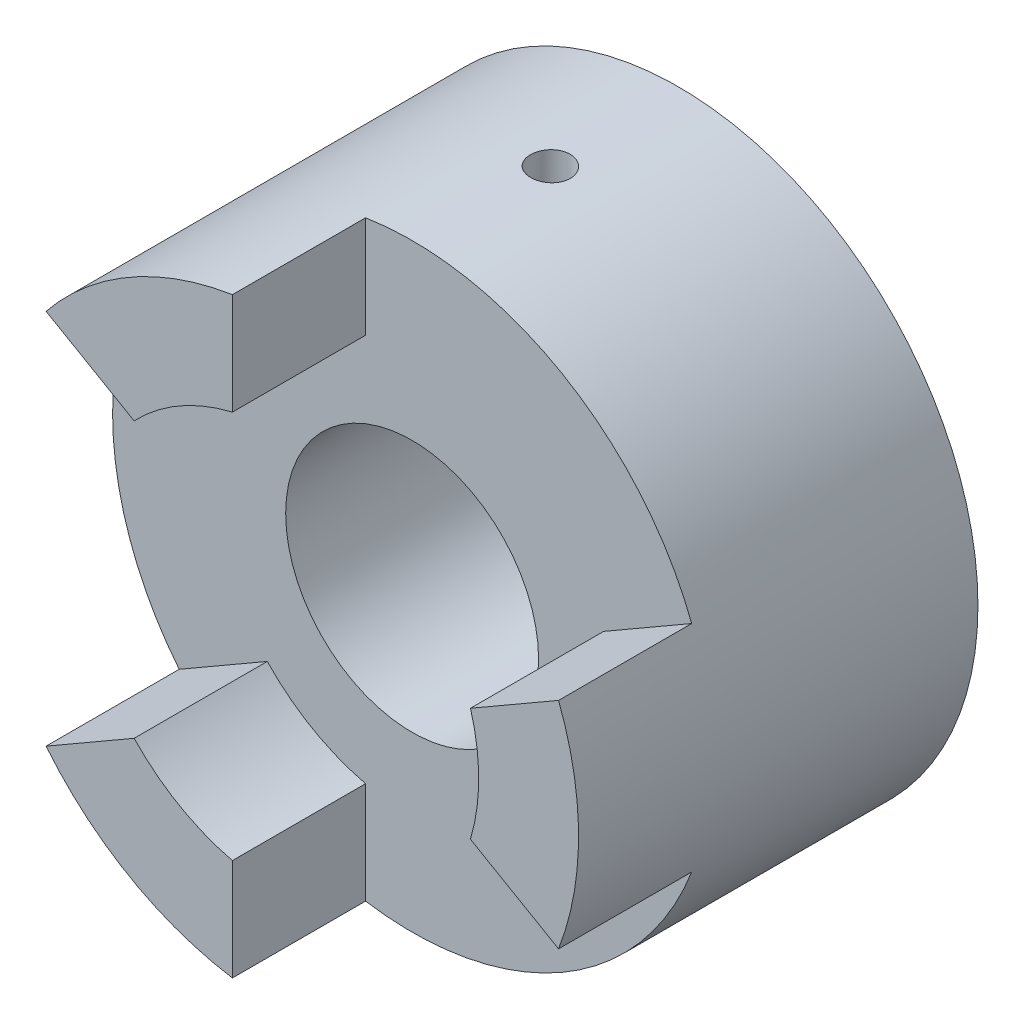
ISO-10303-21;
HEADER;
FILE_DESCRIPTION(('STEP AP214'),'2;1');
FILE_NAME('part.step','',(''),(''),'','','');
FILE_SCHEMA(('AUTOMOTIVE_DESIGN { 1 0 10303 214 1 1 1 1 }'));
ENDSEC;
DATA;
#1=APPLICATION_CONTEXT('core data for automotive mechanical design processes');
#2=APPLICATION_PROTOCOL_DEFINITION('international standard','automotive_design',2000,#1);
#3=PRODUCT_CONTEXT('',#1,'mechanical');
#4=PRODUCT('Part','Part','',(#3));
#5=PRODUCT_RELATED_PRODUCT_CATEGORY('part','',(#4));
#6=PRODUCT_DEFINITION_FORMATION('','',#4);
#7=PRODUCT_DEFINITION_CONTEXT('part definition',#1,'design');
#8=PRODUCT_DEFINITION('design','',#6,#7);
#9=PRODUCT_DEFINITION_SHAPE('','',#8);
#10=(LENGTH_UNIT() NAMED_UNIT(*) SI_UNIT(.MILLI.,.METRE.));
#11=(NAMED_UNIT(*) PLANE_ANGLE_UNIT() SI_UNIT($,.RADIAN.));
#12=(NAMED_UNIT(*) SI_UNIT($,.STERADIAN.) SOLID_ANGLE_UNIT());
#13=UNCERTAINTY_MEASURE_WITH_UNIT(LENGTH_MEASURE(1.E-05),#10,'distance_accuracy_value','');
#14=(GEOMETRIC_REPRESENTATION_CONTEXT(3) GLOBAL_UNCERTAINTY_ASSIGNED_CONTEXT((#13)) GLOBAL_UNIT_ASSIGNED_CONTEXT((#10,
#11,#12)) REPRESENTATION_CONTEXT('',''));
#15=CARTESIAN_POINT('',(0.,0.,0.));
#16=DIRECTION('',(0.,0.,1.));
#17=DIRECTION('',(1.,0.,0.));
#18=AXIS2_PLACEMENT_3D('',#15,#16,#17);
#19=CARTESIAN_POINT('',(0.,0.,20.));
#20=DIRECTION('',(0.,0.,1.));
#21=DIRECTION('',(1.,0.,0.));
#22=AXIS2_PLACEMENT_3D('',#19,#20,#21);
#23=PLANE('',#22);
#24=CARTESIAN_POINT('',(0.,0.,20.));
#25=DIRECTION('',(0.,0.,1.));
#26=DIRECTION('',(1.,0.,0.));
#27=AXIS2_PLACEMENT_3D('',#24,#25,#26);
#28=CIRCLE('',#27,9.5);
#29=CARTESIAN_POINT('',(9.5,0.,20.));
#30=VERTEX_POINT('',#29);
#31=EDGE_CURVE('E244',#30,#30,#28,.T.);
#32=ORIENTED_EDGE('',*,*,#31,.F.);
#33=EDGE_LOOP('',(#32));
#34=FACE_BOUND('',#33,.T.);
#35=CARTESIAN_POINT('',(0.,0.,20.));
#36=DIRECTION('',(0.,0.,-1.));
#37=DIRECTION('',(1.,0.,0.));
#38=AXIS2_PLACEMENT_3D('',#35,#36,#37);
#39=CIRCLE('',#38,15.);
#40=CARTESIAN_POINT('',(-3.5,-14.5859521458148,20.));
#41=VERTEX_POINT('',#40);
#42=CARTESIAN_POINT('',(-10.8818050966599,-10.3240649861528,20.));
#43=VERTEX_POINT('',#42);
#44=EDGE_CURVE('E53',#41,#43,#39,.T.);
#45=ORIENTED_EDGE('',*,*,#44,.F.);
#46=DIRECTION('',(0.,1.,0.));
#47=VECTOR('',#46,1.);
#48=CARTESIAN_POINT('',(-3.5,-14.5859521458148,20.));
#49=LINE('',#48,#47);
#50=CARTESIAN_POINT('',(-3.5,-22.2261107708929,20.));
#51=VERTEX_POINT('',#50);
#52=EDGE_CURVE('E402',#51,#41,#49,.T.);
#53=ORIENTED_EDGE('',*,*,#52,.F.);
#54=CARTESIAN_POINT('',(0.,0.,20.));
#55=DIRECTION('',(0.,0.,1.));
#56=DIRECTION('',(1.,0.,0.));
#57=AXIS2_PLACEMENT_3D('',#54,#55,#56);
#58=CIRCLE('',#57,22.5);
#59=CARTESIAN_POINT('',(20.9983765549201,-8.081966472201,20.));
#60=VERTEX_POINT('',#59);
#61=EDGE_CURVE('E39',#51,#60,#58,.T.);
#62=ORIENTED_EDGE('',*,*,#61,.T.);
#63=DIRECTION('',(0.866025403784436,-0.500000000000004,0.));
#64=VECTOR('',#63,1.);
#65=CARTESIAN_POINT('',(20.9983765549201,-8.081966472201,20.));
#66=LINE('',#65,#64);
#67=CARTESIAN_POINT('',(14.3818050966598,-4.26188715966194,20.));
#68=VERTEX_POINT('',#67);
#69=EDGE_CURVE('E161',#68,#60,#66,.T.);
#70=ORIENTED_EDGE('',*,*,#69,.F.);
#71=CARTESIAN_POINT('',(0.,0.,20.));
#72=DIRECTION('',(0.,0.,-1.));
#73=DIRECTION('',(1.,0.,0.));
#74=AXIS2_PLACEMENT_3D('',#71,#72,#73);
#75=CIRCLE('',#74,15.);
#76=CARTESIAN_POINT('',(14.3818050966598,4.26188715966176,20.));
#77=VERTEX_POINT('',#76);
#78=EDGE_CURVE('E151',#77,#68,#75,.T.);
#79=ORIENTED_EDGE('',*,*,#78,.F.);
#80=DIRECTION('',(-0.866025403784443,-0.499999999999992,0.));
#81=VECTOR('',#80,1.);
#82=CARTESIAN_POINT('',(14.3818050966598,4.26188715966176,20.));
#83=LINE('',#82,#81);
#84=CARTESIAN_POINT('',(20.9983765549202,8.08196647220072,20.));
#85=VERTEX_POINT('',#84);
#86=EDGE_CURVE('E149',#85,#77,#83,.T.);
#87=ORIENTED_EDGE('',*,*,#86,.F.);
#88=CARTESIAN_POINT('',(-3.50000000000001,22.2261107708929,20.));
#89=VERTEX_POINT('',#88);
#90=EDGE_CURVE('E216',#85,#89,#58,.T.);
#91=ORIENTED_EDGE('',*,*,#90,.T.);
#92=DIRECTION('',(0.,1.,0.));
#93=VECTOR('',#92,1.);
#94=CARTESIAN_POINT('',(-3.5,22.2261107708929,20.));
#95=LINE('',#94,#93);
#96=CARTESIAN_POINT('',(-3.5,14.5859521458148,20.));
#97=VERTEX_POINT('',#96);
#98=EDGE_CURVE('E194',#97,#89,#95,.T.);
#99=ORIENTED_EDGE('',*,*,#98,.F.);
#100=CARTESIAN_POINT('',(0.,0.,20.));
#101=DIRECTION('',(0.,0.,-1.));
#102=DIRECTION('',(1.,0.,0.));
#103=AXIS2_PLACEMENT_3D('',#100,#101,#102);
#104=CIRCLE('',#103,15.);
#105=CARTESIAN_POINT('',(-10.8818050966597,10.324064986153,20.));
#106=VERTEX_POINT('',#105);
#107=EDGE_CURVE('E180',#106,#97,#104,.T.);
#108=ORIENTED_EDGE('',*,*,#107,.F.);
#109=DIRECTION('',(0.866025403784436,-0.500000000000004,0.));
#110=VECTOR('',#109,1.);
#111=CARTESIAN_POINT('',(-17.4983765549201,14.1441442986921,20.));
#112=LINE('',#111,#110);
#113=CARTESIAN_POINT('',(-17.4983765549201,14.144144298692,20.));
#114=VERTEX_POINT('',#113);
#115=EDGE_CURVE('E185',#114,#106,#112,.T.);
#116=ORIENTED_EDGE('',*,*,#115,.F.);
#117=CARTESIAN_POINT('',(-17.4983765549203,-14.1441442986918,20.));
#118=VERTEX_POINT('',#117);
#119=EDGE_CURVE('E45',#114,#118,#58,.T.);
#120=ORIENTED_EDGE('',*,*,#119,.T.);
#121=DIRECTION('',(-0.866025403784443,-0.499999999999992,0.));
#122=VECTOR('',#121,1.);
#123=CARTESIAN_POINT('',(-17.4983765549203,-14.1441442986918,20.));
#124=LINE('',#123,#122);
#125=EDGE_CURVE('E58',#43,#118,#124,.T.);
#126=ORIENTED_EDGE('',*,*,#125,.F.);
#127=EDGE_LOOP('',(#45,#53,#62,#70,#79,#87,#91,#99,#108,#116,#120,#126));
#128=FACE_BOUND('',#127,.T.);
#129=ADVANCED_FACE('F34',(#34,#128),#23,.T.);
#130=CARTESIAN_POINT('',(0.,0.,20.));
#131=DIRECTION('',(0.,0.,-1.));
#132=DIRECTION('',(-1.,0.,0.));
#133=AXIS2_PLACEMENT_3D('',#130,#131,#132);
#134=CYLINDRICAL_SURFACE('',#133,22.5);
#135=CARTESIAN_POINT('',(-1.16795072214175,22.4696660213419,9.9509839765561));
#136=CARTESIAN_POINT('',(-1.16794701412822,22.4696666351266,9.86682882468708));
#137=CARTESIAN_POINT('',(-1.16083853462614,22.4700392018296,9.78261503637612));
#138=CARTESIAN_POINT('',(-1.13258449434566,22.471480697484,9.61651364954389));
#139=CARTESIAN_POINT('',(-1.11142267175415,22.4725504331371,9.5346288606282));
#140=CARTESIAN_POINT('',(-1.05567496758904,22.4752380311045,9.37561546316127));
#141=CARTESIAN_POINT('',(-1.02109626483874,22.4768556002368,9.29848433665232));
#142=CARTESIAN_POINT('',(-0.939510841472762,22.4804132200468,9.15113626091315));
#143=CARTESIAN_POINT('',(-0.892506933100566,22.4823531977157,9.08091775205354));
#144=CARTESIAN_POINT('',(-0.787321799091392,22.4862822653723,8.9492495333017));
#145=CARTESIAN_POINT('',(-0.729123980123893,22.488271424401,8.88781308018272));
#146=CARTESIAN_POINT('',(-0.603241089186681,22.4919998434333,8.77556647860183));
#147=CARTESIAN_POINT('',(-0.535555618423458,22.4937390929262,8.72475677703693));
#148=CARTESIAN_POINT('',(-0.392546510837813,22.4966890716028,8.63516458913433));
#149=CARTESIAN_POINT('',(-0.317215933429358,22.4978993151447,8.59639316367709));
#150=CARTESIAN_POINT('',(-0.161106583630494,22.4995584749486,8.53204891038463));
#151=CARTESIAN_POINT('',(-0.0803278761180135,22.500007400275,8.50647592540988));
#152=CARTESIAN_POINT('',(0.0842541461032171,22.4999924287302,8.46929151286395));
#153=CARTESIAN_POINT('',(0.168052740501643,22.499529900542,8.4576591934942));
#154=CARTESIAN_POINT('',(0.336402293717323,22.4976425119387,8.44862178180597));
#155=CARTESIAN_POINT('',(0.420953243062837,22.4962176636219,8.45121651062898));
#156=CARTESIAN_POINT('',(0.588266129708601,22.4924639826339,8.47054233443924));
#157=CARTESIAN_POINT('',(0.67103069653389,22.4901365901524,8.48725095768299));
#158=CARTESIAN_POINT('',(0.832565993292586,22.4847363612551,8.53429538928928));
#159=CARTESIAN_POINT('',(0.911336697020258,22.4816635199487,8.56463128705432));
#160=CARTESIAN_POINT('',(1.06272261164742,22.4750166272793,8.63809451797387));
#161=CARTESIAN_POINT('',(1.13533287297505,22.4714421789089,8.6812320136648));
#162=CARTESIAN_POINT('',(1.2722859030292,22.4641046836031,8.77906653524814));
#163=CARTESIAN_POINT('',(1.33662856545644,22.4603416342438,8.83376370974329));
#164=CARTESIAN_POINT('',(1.45535453244866,22.4529618562286,8.95329180612418));
#165=CARTESIAN_POINT('',(1.50971821721403,22.449345426488,9.01814223651269));
#166=CARTESIAN_POINT('',(1.60679530484671,22.4426064521477,9.15606769541081));
#167=CARTESIAN_POINT('',(1.64950870236193,22.439483907775,9.22914272769877));
#168=CARTESIAN_POINT('',(1.7220745704774,22.4340319588832,9.38145576222379));
#169=CARTESIAN_POINT('',(1.75192618133141,22.4317026073872,9.46069417603434));
#170=CARTESIAN_POINT('',(1.79790975507206,22.4280640531212,9.62307881670943));
#171=CARTESIAN_POINT('',(1.81404190173043,22.4267548366865,9.7062249912139));
#172=CARTESIAN_POINT('',(1.83210546711131,22.4252864697945,9.87389368251136));
#173=CARTESIAN_POINT('',(1.83406414738777,22.4251251115319,9.95841324354472));
#174=CARTESIAN_POINT('',(1.82379660597111,22.4259624418472,10.1265800340995));
#175=CARTESIAN_POINT('',(1.81157046841159,22.4269611235448,10.2102272687919));
#176=CARTESIAN_POINT('',(1.77330198524295,22.430019264112,10.3741975858724));
#177=CARTESIAN_POINT('',(1.74727222536644,22.432077756628,10.4545236246261));
#178=CARTESIAN_POINT('',(1.68214605935868,22.4370551772429,10.60966269689));
#179=CARTESIAN_POINT('',(1.64304951843054,22.4399741142182,10.6844756735177));
#180=CARTESIAN_POINT('',(1.5528271333128,22.4463976750895,10.8265902326363));
#181=CARTESIAN_POINT('',(1.50168303140065,22.4499031855614,10.8938801836915));
#182=CARTESIAN_POINT('',(1.38884040962061,22.4571661269891,11.0189213375547));
#183=CARTESIAN_POINT('',(1.3271417726129,22.4609235607405,11.0766724344814));
#184=CARTESIAN_POINT('',(1.19482048170147,22.4683509312009,11.1810888947149));
#185=CARTESIAN_POINT('',(1.1241838714648,22.4720207201659,11.2277365849532));
#186=CARTESIAN_POINT('',(0.976058442943612,22.4789412520019,11.3085010832813));
#187=CARTESIAN_POINT('',(0.89856967163721,22.4821919977453,11.3426179772733));
#188=CARTESIAN_POINT('',(0.739001568444851,22.4880021362221,11.3973217571046));
#189=CARTESIAN_POINT('',(0.656926076696509,22.4905620971359,11.4179197825061));
#190=CARTESIAN_POINT('',(0.49045958171309,22.4948078152173,11.445037570028));
#191=CARTESIAN_POINT('',(0.40606860499338,22.4964935823911,11.4515574932931));
#192=CARTESIAN_POINT('',(0.237540917170963,22.4989035911875,11.4503323899263));
#193=CARTESIAN_POINT('',(0.153404030342545,22.4996296909851,11.4426150002337));
#194=CARTESIAN_POINT('',(-0.0123898446146695,22.5001493640251,11.4131917004924));
#195=CARTESIAN_POINT('',(-0.094046828527573,22.4999429356823,11.3914857666642));
#196=CARTESIAN_POINT('',(-0.252564896325961,22.4987221590962,11.3347079254833));
#197=CARTESIAN_POINT('',(-0.329426048193699,22.4977078223081,11.2996362076445));
#198=CARTESIAN_POINT('',(-0.476181328642586,22.4950804526772,11.2171260186757));
#199=CARTESIAN_POINT('',(-0.546075625279928,22.4934674342804,11.1696878459523));
#200=CARTESIAN_POINT('',(-0.677050473510534,22.4899068565662,11.0636887007921));
#201=CARTESIAN_POINT('',(-0.738114734161111,22.4879586930601,11.0051076197651));
#202=CARTESIAN_POINT('',(-0.849564286877072,22.4840245335145,10.8785150339242));
#203=CARTESIAN_POINT('',(-0.899946966889859,22.4820385283505,10.8105012291612));
#204=CARTESIAN_POINT('',(-0.9886424430826,22.47831322808,10.666886676364));
#205=CARTESIAN_POINT('',(-1.02693884290122,22.4765742698621,10.5912758037275));
#206=CARTESIAN_POINT('',(-1.09023738754139,22.47359330319,10.4347413302532));
#207=CARTESIAN_POINT('',(-1.11525505244659,22.4723507150045,10.3538240563899));
#208=CARTESIAN_POINT('',(-1.14480459317688,22.4708599339827,10.2188429666264));
#209=CARTESIAN_POINT('',(-1.15347308513632,22.4704146367155,10.165650945378));
#210=CARTESIAN_POINT('',(-1.16504733114898,22.4698174842866,10.0586419413207));
#211=CARTESIAN_POINT('',(-1.16795309446345,22.4696656286533,10.0048249595162));
#212=CARTESIAN_POINT('',(-1.16795072214175,22.4696660213419,9.9509839765561));
#213=B_SPLINE_CURVE_WITH_KNOTS('',3,(#135,#136,#137,#138,#139,#140,#141,#142,#143,#144,#145,
#146,#147,#148,#149,#150,#151,#152,#153,#154,#155,#156,#157,#158,#159,#160,#161,#162,#163,#164,
#165,#166,#167,#168,#169,#170,#171,#172,#173,#174,#175,#176,#177,#178,#179,#180,#181,#182,#183,
#184,#185,#186,#187,#188,#189,#190,#191,#192,#193,#194,#195,#196,#197,#198,#199,#200,#201,#202,
#203,#204,#205,#206,#207,#208,#209,#210,#211,#212),.UNSPECIFIED.,.T.,.F.,(4,2,2,2,2,2,2,2,2,2,2,
2,2,2,2,2,2,2,2,2,2,2,2,2,2,2,2,2,2,2,2,2,2,2,2,2,2,2,4),(0.,0.252268897261408,
0.504830217080159,0.757256587612157,1.0096258743797,1.26237218560875,1.51512912368541,
1.76811761462682,2.02110309343897,2.27370896646024,2.52631166379775,2.7785129306925,
3.03071585219184,3.28311952276676,3.53552643825509,3.78842441965064,4.04132251722657,
4.2942375171565,4.54714912924566,4.7995741560111,5.05199768558994,5.30419145760964,
5.55638783133998,5.80896888837173,6.06155274886383,6.31453599310349,6.567517503036,
6.82029029333925,7.07306019026671,7.32533993592649,7.57762011044376,7.82989670800653,
8.0821672186178,8.33489737367269,8.58768925975639,8.84082262604519,9.09365947683888,
9.25505693053532,9.41645412485044),.UNSPECIFIED.);
#214=CARTESIAN_POINT('',(-1.16795072214175,22.4696660213419,9.9509839765561));
#215=VERTEX_POINT('',#214);
#216=EDGE_CURVE('E11',#215,#215,#213,.T.);
#217=ORIENTED_EDGE('',*,*,#216,.T.);
#218=EDGE_LOOP('',(#217));
#219=FACE_BOUND('',#218,.T.);
#220=ORIENTED_EDGE('',*,*,#119,.F.);
#221=DIRECTION('',(0.,0.,-1.));
#222=VECTOR('',#221,1.);
#223=CARTESIAN_POINT('',(-17.4983765549201,14.1441442986921,30.));
#224=LINE('',#223,#222);
#225=CARTESIAN_POINT('',(-17.4983765549201,14.1441442986921,30.));
#226=VERTEX_POINT('',#225);
#227=EDGE_CURVE('E206',#226,#114,#224,.T.);
#228=ORIENTED_EDGE('',*,*,#227,.F.);
#229=CARTESIAN_POINT('',(0.,0.,30.));
#230=DIRECTION('',(0.,0.,1.));
#231=DIRECTION('',(1.,0.,0.));
#232=AXIS2_PLACEMENT_3D('',#229,#230,#231);
#233=CIRCLE('',#232,22.5);
#234=CARTESIAN_POINT('',(-3.50000000000001,22.2261107708929,30.));
#235=VERTEX_POINT('',#234);
#236=EDGE_CURVE('E187',#235,#226,#233,.T.);
#237=ORIENTED_EDGE('',*,*,#236,.F.);
#238=DIRECTION('',(0.,0.,-1.));
#239=VECTOR('',#238,1.);
#240=CARTESIAN_POINT('',(-3.50000000000001,22.2261107708929,30.));
#241=LINE('',#240,#239);
#242=EDGE_CURVE('E202',#235,#89,#241,.T.);
#243=ORIENTED_EDGE('',*,*,#242,.T.);
#244=ORIENTED_EDGE('',*,*,#90,.F.);
#245=DIRECTION('',(0.,0.,-1.));
#246=VECTOR('',#245,1.);
#247=CARTESIAN_POINT('',(20.9983765549202,8.08196647220072,30.));
#248=LINE('',#247,#246);
#249=CARTESIAN_POINT('',(20.9983765549202,8.08196647220072,30.));
#250=VERTEX_POINT('',#249);
#251=EDGE_CURVE('E178',#250,#85,#248,.T.);
#252=ORIENTED_EDGE('',*,*,#251,.F.);
#253=CARTESIAN_POINT('',(0.,0.,30.));
#254=DIRECTION('',(0.,0.,1.));
#255=DIRECTION('',(1.,0.,0.));
#256=AXIS2_PLACEMENT_3D('',#253,#254,#255);
#257=CIRCLE('',#256,22.5);
#258=CARTESIAN_POINT('',(20.9983765549201,-8.081966472201,30.));
#259=VERTEX_POINT('',#258);
#260=EDGE_CURVE('E157',#259,#250,#257,.T.);
#261=ORIENTED_EDGE('',*,*,#260,.F.);
#262=DIRECTION('',(0.,0.,-1.));
#263=VECTOR('',#262,1.);
#264=CARTESIAN_POINT('',(20.9983765549201,-8.081966472201,30.));
#265=LINE('',#264,#263);
#266=EDGE_CURVE('E166',#259,#60,#265,.T.);
#267=ORIENTED_EDGE('',*,*,#266,.T.);
#268=ORIENTED_EDGE('',*,*,#61,.F.);
#269=DIRECTION('',(0.,0.,-1.));
#270=VECTOR('',#269,1.);
#271=CARTESIAN_POINT('',(-3.5,-22.2261107708929,30.));
#272=LINE('',#271,#270);
#273=CARTESIAN_POINT('',(-3.5,-22.2261107708929,30.));
#274=VERTEX_POINT('',#273);
#275=EDGE_CURVE('E130',#274,#51,#272,.T.);
#276=ORIENTED_EDGE('',*,*,#275,.F.);
#277=CARTESIAN_POINT('',(0.,0.,30.));
#278=DIRECTION('',(0.,0.,1.));
#279=DIRECTION('',(1.,0.,0.));
#280=AXIS2_PLACEMENT_3D('',#277,#278,#279);
#281=CIRCLE('',#280,22.5);
#282=CARTESIAN_POINT('',(-17.4983765549203,-14.1441442986918,30.));
#283=VERTEX_POINT('',#282);
#284=EDGE_CURVE('E136',#283,#274,#281,.T.);
#285=ORIENTED_EDGE('',*,*,#284,.F.);
#286=DIRECTION('',(0.,0.,-1.));
#287=VECTOR('',#286,1.);
#288=CARTESIAN_POINT('',(-17.4983765549203,-14.1441442986918,30.));
#289=LINE('',#288,#287);
#290=EDGE_CURVE('E394',#283,#118,#289,.T.);
#291=ORIENTED_EDGE('',*,*,#290,.T.);
#292=EDGE_LOOP('',(#220,#228,#237,#243,#244,#252,#261,#267,#268,#276,#285,#291));
#293=FACE_BOUND('',#292,.T.);
#294=CARTESIAN_POINT('',(0.,0.,0.));
#295=DIRECTION('',(0.,0.,1.));
#296=DIRECTION('',(1.,0.,0.));
#297=AXIS2_PLACEMENT_3D('',#294,#295,#296);
#298=CIRCLE('',#297,22.5);
#299=CARTESIAN_POINT('',(22.5,0.,0.));
#300=VERTEX_POINT('',#299);
#301=EDGE_CURVE('E217',#300,#300,#298,.T.);
#302=ORIENTED_EDGE('',*,*,#301,.T.);
#303=EDGE_LOOP('',(#302));
#304=FACE_BOUND('',#303,.T.);
#305=ADVANCED_FACE('F36',(#219,#293,#304),#134,.T.);
#306=CARTESIAN_POINT('',(0.,0.,0.));
#307=DIRECTION('',(0.,0.,1.));
#308=DIRECTION('',(1.,0.,0.));
#309=AXIS2_PLACEMENT_3D('',#306,#307,#308);
#310=PLANE('',#309);
#311=CARTESIAN_POINT('',(0.,0.,0.));
#312=DIRECTION('',(0.,0.,1.));
#313=DIRECTION('',(1.,0.,0.));
#314=AXIS2_PLACEMENT_3D('',#311,#312,#313);
#315=CIRCLE('',#314,9.5);
#316=CARTESIAN_POINT('',(9.5,0.,0.));
#317=VERTEX_POINT('',#316);
#318=EDGE_CURVE('E246',#317,#317,#315,.F.);
#319=ORIENTED_EDGE('',*,*,#318,.F.);
#320=EDGE_LOOP('',(#319));
#321=FACE_BOUND('',#320,.T.);
#322=ORIENTED_EDGE('',*,*,#301,.F.);
#323=EDGE_LOOP('',(#322));
#324=FACE_BOUND('',#323,.T.);
#325=ADVANCED_FACE('F253',(#321,#324),#310,.F.);
#326=CARTESIAN_POINT('',(0.,0.,-0.001000000000001));
#327=DIRECTION('',(0.,0.,1.));
#328=DIRECTION('',(1.,0.,0.));
#329=AXIS2_PLACEMENT_3D('',#326,#327,#328);
#330=CYLINDRICAL_SURFACE('',#329,9.5);
#331=CARTESIAN_POINT('',(-1.36115597571916,9.40198140871189,9.9509839765561));
#332=CARTESIAN_POINT('',(-1.36115253914215,9.40198281245498,10.0346742455621));
#333=CARTESIAN_POINT('',(-1.35411224559917,9.40300947241227,10.1184117707957));
#334=CARTESIAN_POINT('',(-1.32614814886704,9.40699329934969,10.283541780249));
#335=CARTESIAN_POINT('',(-1.30521114430422,9.40995230194241,10.3649319577858));
#336=CARTESIAN_POINT('',(-1.25010304295562,9.4174311968943,10.5229533497409));
#337=CARTESIAN_POINT('',(-1.21594251869013,9.42194984197006,10.5995883094175));
#338=CARTESIAN_POINT('',(-1.1353888811009,9.43199512058911,10.7460408867916));
#339=CARTESIAN_POINT('',(-1.08899730967102,9.43752162705037,10.8158593622827));
#340=CARTESIAN_POINT('',(-0.984867533043411,9.44895725764281,10.9473252206433));
#341=CARTESIAN_POINT('',(-0.927042317433202,9.4548690669787,11.0089034608696));
#342=CARTESIAN_POINT('',(-0.801883491296819,9.46630466911595,11.1215410511287));
#343=CARTESIAN_POINT('',(-0.734549339836176,9.47182843981618,11.1725998023333));
#344=CARTESIAN_POINT('',(-0.591846216919601,9.48181698493635,11.2630062325207));
#345=CARTESIAN_POINT('',(-0.516436260280158,9.48627594690666,11.3022899195487));
#346=CARTESIAN_POINT('',(-0.360008976361948,9.4934986500044,11.3676201421814));
#347=CARTESIAN_POINT('',(-0.278991977074463,9.49626249019707,11.3936674513229));
#348=CARTESIAN_POINT('',(-0.114368848571442,9.49966517294385,11.4315750443693));
#349=CARTESIAN_POINT('',(-0.0307897953114429,9.50032146517547,11.4435513033722));
#350=CARTESIAN_POINT('',(0.137178550185515,9.49938067546758,11.4533371860213));
#351=CARTESIAN_POINT('',(0.22156779243625,9.49778373166983,11.4511476781151));
#352=CARTESIAN_POINT('',(0.387969702213226,9.49243650227087,11.4327552047354));
#353=CARTESIAN_POINT('',(0.469996830327012,9.48870549181023,11.4166770287967));
#354=CARTESIAN_POINT('',(0.630145994588965,9.47941739280467,11.3711597848855));
#355=CARTESIAN_POINT('',(0.7082679214915,9.47386025320781,11.3417203433717));
#356=CARTESIAN_POINT('',(0.85876868608471,9.46140833269284,11.2701902204032));
#357=CARTESIAN_POINT('',(0.931122332191321,9.45450809378391,11.2280475194306));
#358=CARTESIAN_POINT('',(1.06776613364092,9.44005315818821,11.1323451930293));
#359=CARTESIAN_POINT('',(1.1320557013435,9.43249841387447,11.0787847363401));
#360=CARTESIAN_POINT('',(1.25148955585435,9.41740112420624,10.9610735004421));
#361=CARTESIAN_POINT('',(1.30652659198367,9.40985960820693,10.8968137137863));
#362=CARTESIAN_POINT('',(1.40506368009421,9.39565230191346,10.759896852389));
#363=CARTESIAN_POINT('',(1.4485636456803,9.3889865181774,10.6872397147698));
#364=CARTESIAN_POINT('',(1.52281685651777,9.37723041347014,10.535473030119));
#365=CARTESIAN_POINT('',(1.55355822839621,9.37214156112977,10.4563575543972));
#366=CARTESIAN_POINT('',(1.60131525597999,9.3641006798062,10.2939845559654));
#367=CARTESIAN_POINT('',(1.61833198942496,9.36114848304206,10.210727359033));
#368=CARTESIAN_POINT('',(1.63801162553281,9.35772504719848,10.0433910208972));
#369=CARTESIAN_POINT('',(1.64082658850659,9.35722752683816,9.95933028533786));
#370=CARTESIAN_POINT('',(1.63242763307638,9.3586963568064,9.79193691762305));
#371=CARTESIAN_POINT('',(1.62121419883702,9.36066262210189,9.70860426043929));
#372=CARTESIAN_POINT('',(1.58520377244347,9.36682743545753,9.5455103071934));
#373=CARTESIAN_POINT('',(1.56048330371513,9.37101340399552,9.46573160484263));
#374=CARTESIAN_POINT('',(1.49823571047918,9.38116614933604,9.31145963583998));
#375=CARTESIAN_POINT('',(1.46070789126177,9.38713302273806,9.23696665616666));
#376=CARTESIAN_POINT('',(1.37354175569231,9.40028374889835,9.09469966123914));
#377=CARTESIAN_POINT('',(1.32380535484661,9.4074773063832,9.02698665095073));
#378=CARTESIAN_POINT('',(1.21376120265728,9.42230644088809,8.90083048796352));
#379=CARTESIAN_POINT('',(1.15345278666418,9.42994204567887,8.84238791852612));
#380=CARTESIAN_POINT('',(1.02329615023264,9.44495568324637,8.73587993862279));
#381=CARTESIAN_POINT('',(0.953364607576278,9.45233066882901,8.68791584279286));
#382=CARTESIAN_POINT('',(0.806332780579432,9.46600607372832,8.60443394532675));
#383=CARTESIAN_POINT('',(0.729232709342689,9.47230652497262,8.56891577385168));
#384=CARTESIAN_POINT('',(0.5703549020701,9.48319590011388,8.51149389638008));
#385=CARTESIAN_POINT('',(0.488597271692454,9.48779161992282,8.48953589466064));
#386=CARTESIAN_POINT('',(0.322467040732424,9.49488929406412,8.45968233858567));
#387=CARTESIAN_POINT('',(0.238094632831243,9.49739140229467,8.451785750549));
#388=CARTESIAN_POINT('',(0.0701085938880571,9.50010873801922,8.45030649043676));
#389=CARTESIAN_POINT('',(-0.0135033191928817,9.50034852137909,8.45656920275451));
#390=CARTESIAN_POINT('',(-0.178500475729958,9.49868131024676,8.48289796673011));
#391=CARTESIAN_POINT('',(-0.259885728661228,9.49677432489117,8.50296395964119));
#392=CARTESIAN_POINT('',(-0.418065365848644,9.49112662040563,8.55627273791535));
#393=CARTESIAN_POINT('',(-0.494863803318522,9.48738754795355,8.58950368550565));
#394=CARTESIAN_POINT('',(-0.641838863729622,9.47857952598807,8.66818226348193));
#395=CARTESIAN_POINT('',(-0.712015225359096,9.47351052402453,8.71363037569364));
#396=CARTESIAN_POINT('',(-0.844529526114883,9.46262342797937,8.81600725291761));
#397=CARTESIAN_POINT('',(-0.906779008068327,9.45679813683462,8.87304976088792));
#398=CARTESIAN_POINT('',(-1.02087771957161,9.44516312502513,8.99675700962073));
#399=CARTESIAN_POINT('',(-1.07272450828576,9.43935340832948,9.0634240023291));
#400=CARTESIAN_POINT('',(-1.16483358776286,9.42843220461251,9.20498240803796));
#401=CARTESIAN_POINT('',(-1.2050211084465,9.42332533000347,9.27992282587012));
#402=CARTESIAN_POINT('',(-1.27215650707061,9.41449808717991,9.43553372880782));
#403=CARTESIAN_POINT('',(-1.29911788892886,9.41077630572344,9.5161982728131));
#404=CARTESIAN_POINT('',(-1.33303232872565,9.40602015513415,9.65616684834494));
#405=CARTESIAN_POINT('',(-1.34356210652009,9.40451443406952,9.71461394254036));
#406=CARTESIAN_POINT('',(-1.35762509474186,9.40249457089038,9.83236077718956));
#407=CARTESIAN_POINT('',(-1.36115841172137,9.40198041367489,9.89166050464435));
#408=CARTESIAN_POINT('',(-1.36115597571916,9.40198140871189,9.9509839765561));
#409=B_SPLINE_CURVE_WITH_KNOTS('',3,(#331,#332,#333,#334,#335,#336,#337,#338,#339,#340,#341,
#342,#343,#344,#345,#346,#347,#348,#349,#350,#351,#352,#353,#354,#355,#356,#357,#358,#359,#360,
#361,#362,#363,#364,#365,#366,#367,#368,#369,#370,#371,#372,#373,#374,#375,#376,#377,#378,#379,
#380,#381,#382,#383,#384,#385,#386,#387,#388,#389,#390,#391,#392,#393,#394,#395,#396,#397,#398,
#399,#400,#401,#402,#403,#404,#405,#406,#407,#408),.UNSPECIFIED.,.T.,.F.,(4,2,2,2,2,2,2,2,2,2,2,
2,2,2,2,2,2,2,2,2,2,2,2,2,2,2,2,2,2,2,2,2,2,2,2,2,2,2,4),(0.,0.250853927262163,
0.501946498416266,0.752838728320955,1.00369934487581,1.2565480788977,1.50941120251429,
1.76362459165416,2.01782312279827,2.26991148848837,2.52198439977626,2.77181572176522,
3.02165402872707,3.2725296457977,3.5234235339093,3.77705047333305,4.03067931198402,
4.28454365571367,4.53838806257508,4.78950866646249,5.0406206036175,5.29032441173716,
5.54004176670725,5.79183509438417,6.04364425767603,6.29778980620818,6.55192780199646,
6.80504150202867,7.05813659442518,7.30848132386846,7.5588249878512,7.80894405482678,
8.05907298755208,8.31178569360904,8.56455762574334,8.81891644248637,9.0730150149629,
9.25083440456599,9.42865108605873),.UNSPECIFIED.);
#410=CARTESIAN_POINT('',(-1.36115597571916,9.40198140871189,9.9509839765561));
#411=VERTEX_POINT('',#410);
#412=EDGE_CURVE('E239',#411,#411,#409,.T.);
#413=ORIENTED_EDGE('',*,*,#412,.T.);
#414=EDGE_LOOP('',(#413));
#415=FACE_BOUND('',#414,.T.);
#416=ORIENTED_EDGE('',*,*,#31,.T.);
#417=EDGE_LOOP('',(#416));
#418=FACE_BOUND('',#417,.T.);
#419=ORIENTED_EDGE('',*,*,#318,.T.);
#420=EDGE_LOOP('',(#419));
#421=FACE_BOUND('',#420,.T.);
#422=ADVANCED_FACE('F232',(#415,#418,#421),#330,.F.);
#423=CARTESIAN_POINT('',(0.332625348918888,22.4975412073688,9.9509839765561));
#424=DIRECTION('',(0.0147833488408394,0.999890720327502,0.));
#425=DIRECTION('',(-0.999890720327502,0.0147833488408394,0.));
#426=AXIS2_PLACEMENT_3D('',#423,#424,#425);
#427=CYLINDRICAL_SURFACE('',#426,1.49999999999999);
#428=ORIENTED_EDGE('',*,*,#216,.F.);
#429=EDGE_LOOP('',(#428));
#430=FACE_BOUND('',#429,.T.);
#431=ORIENTED_EDGE('',*,*,#412,.F.);
#432=EDGE_LOOP('',(#431));
#433=FACE_BOUND('',#432,.T.);
#434=ADVANCED_FACE('F226',(#430,#433),#427,.F.);
#435=CARTESIAN_POINT('',(0.,0.,30.));
#436=DIRECTION('',(0.,0.,-1.));
#437=DIRECTION('',(-1.,0.,0.));
#438=AXIS2_PLACEMENT_3D('',#435,#436,#437);
#439=CYLINDRICAL_SURFACE('',#438,15.);
#440=ORIENTED_EDGE('',*,*,#107,.T.);
#441=DIRECTION('',(0.,0.,-1.));
#442=VECTOR('',#441,1.);
#443=CARTESIAN_POINT('',(-3.5,14.5859521458148,30.));
#444=LINE('',#443,#442);
#445=CARTESIAN_POINT('',(-3.5,14.5859521458148,30.));
#446=VERTEX_POINT('',#445);
#447=EDGE_CURVE('E205',#446,#97,#444,.T.);
#448=ORIENTED_EDGE('',*,*,#447,.F.);
#449=CARTESIAN_POINT('',(0.,0.,30.));
#450=DIRECTION('',(0.,0.,-1.));
#451=DIRECTION('',(1.,0.,0.));
#452=AXIS2_PLACEMENT_3D('',#449,#450,#451);
#453=CIRCLE('',#452,15.);
#454=CARTESIAN_POINT('',(-10.8818050966597,10.324064986153,30.));
#455=VERTEX_POINT('',#454);
#456=EDGE_CURVE('E181',#455,#446,#453,.T.);
#457=ORIENTED_EDGE('',*,*,#456,.F.);
#458=DIRECTION('',(0.,0.,-1.));
#459=VECTOR('',#458,1.);
#460=CARTESIAN_POINT('',(-10.8818050966597,10.324064986153,30.));
#461=LINE('',#460,#459);
#462=EDGE_CURVE('E191',#455,#106,#461,.T.);
#463=ORIENTED_EDGE('',*,*,#462,.T.);
#464=EDGE_LOOP('',(#440,#448,#457,#463));
#465=FACE_BOUND('',#464,.T.);
#466=ADVANCED_FACE('F231',(#465),#439,.F.);
#467=CARTESIAN_POINT('',(-3.5,22.2261107708929,30.));
#468=DIRECTION('',(-1.,0.,0.));
#469=DIRECTION('',(0.,-1.,0.));
#470=AXIS2_PLACEMENT_3D('',#467,#468,#469);
#471=PLANE('',#470);
#472=ORIENTED_EDGE('',*,*,#98,.T.);
#473=ORIENTED_EDGE('',*,*,#242,.F.);
#474=DIRECTION('',(0.,1.,0.));
#475=VECTOR('',#474,1.);
#476=CARTESIAN_POINT('',(-3.5,22.2261107708929,30.));
#477=LINE('',#476,#475);
#478=EDGE_CURVE('E184',#446,#235,#477,.T.);
#479=ORIENTED_EDGE('',*,*,#478,.F.);
#480=ORIENTED_EDGE('',*,*,#447,.T.);
#481=EDGE_LOOP('',(#472,#473,#479,#480));
#482=FACE_BOUND('',#481,.T.);
#483=ADVANCED_FACE('F285',(#482),#471,.F.);
#484=CARTESIAN_POINT('',(-17.4983765549201,14.1441442986921,30.));
#485=DIRECTION('',(0.500000000000004,0.866025403784436,0.));
#486=DIRECTION('',(-0.866025403784436,0.500000000000004,0.));
#487=AXIS2_PLACEMENT_3D('',#484,#485,#486);
#488=PLANE('',#487);
#489=ORIENTED_EDGE('',*,*,#115,.T.);
#490=ORIENTED_EDGE('',*,*,#462,.F.);
#491=DIRECTION('',(0.866025403784436,-0.500000000000004,0.));
#492=VECTOR('',#491,1.);
#493=CARTESIAN_POINT('',(-17.4983765549201,14.1441442986921,30.));
#494=LINE('',#493,#492);
#495=EDGE_CURVE('E189',#226,#455,#494,.T.);
#496=ORIENTED_EDGE('',*,*,#495,.F.);
#497=ORIENTED_EDGE('',*,*,#227,.T.);
#498=EDGE_LOOP('',(#489,#490,#496,#497));
#499=FACE_BOUND('',#498,.T.);
#500=ADVANCED_FACE('F294',(#499),#488,.F.);
#501=CARTESIAN_POINT('',(0.,0.,30.));
#502=DIRECTION('',(0.,0.,1.));
#503=DIRECTION('',(1.,0.,0.));
#504=AXIS2_PLACEMENT_3D('',#501,#502,#503);
#505=PLANE('',#504);
#506=ORIENTED_EDGE('',*,*,#456,.T.);
#507=ORIENTED_EDGE('',*,*,#478,.T.);
#508=ORIENTED_EDGE('',*,*,#236,.T.);
#509=ORIENTED_EDGE('',*,*,#495,.T.);
#510=EDGE_LOOP('',(#506,#507,#508,#509));
#511=FACE_BOUND('',#510,.T.);
#512=ADVANCED_FACE('F303',(#511),#505,.T.);
#513=CARTESIAN_POINT('',(14.3818050966598,4.26188715966176,30.));
#514=DIRECTION('',(0.499999999999992,-0.866025403784443,0.));
#515=DIRECTION('',(0.866025403784443,0.499999999999992,0.));
#516=AXIS2_PLACEMENT_3D('',#513,#514,#515);
#517=PLANE('',#516);
#518=ORIENTED_EDGE('',*,*,#86,.T.);
#519=DIRECTION('',(0.,0.,-1.));
#520=VECTOR('',#519,1.);
#521=CARTESIAN_POINT('',(14.3818050966598,4.26188715966176,30.));
#522=LINE('',#521,#520);
#523=CARTESIAN_POINT('',(14.3818050966598,4.26188715966176,30.));
#524=VERTEX_POINT('',#523);
#525=EDGE_CURVE('E175',#524,#77,#522,.T.);
#526=ORIENTED_EDGE('',*,*,#525,.F.);
#527=DIRECTION('',(-0.866025403784443,-0.499999999999992,0.));
#528=VECTOR('',#527,1.);
#529=CARTESIAN_POINT('',(14.3818050966598,4.26188715966176,30.));
#530=LINE('',#529,#528);
#531=EDGE_CURVE('E160',#250,#524,#530,.T.);
#532=ORIENTED_EDGE('',*,*,#531,.F.);
#533=ORIENTED_EDGE('',*,*,#251,.T.);
#534=EDGE_LOOP('',(#518,#526,#532,#533));
#535=FACE_BOUND('',#534,.T.);
#536=ADVANCED_FACE('F313',(#535),#517,.F.);
#537=CARTESIAN_POINT('',(0.,0.,30.));
#538=DIRECTION('',(0.,0.,-1.));
#539=DIRECTION('',(-1.,0.,0.));
#540=AXIS2_PLACEMENT_3D('',#537,#538,#539);
#541=CYLINDRICAL_SURFACE('',#540,15.);
#542=ORIENTED_EDGE('',*,*,#78,.T.);
#543=DIRECTION('',(0.,0.,-1.));
#544=VECTOR('',#543,1.);
#545=CARTESIAN_POINT('',(14.3818050966598,-4.26188715966194,30.));
#546=LINE('',#545,#544);
#547=CARTESIAN_POINT('',(14.3818050966598,-4.26188715966194,30.));
#548=VERTEX_POINT('',#547);
#549=EDGE_CURVE('E173',#548,#68,#546,.T.);
#550=ORIENTED_EDGE('',*,*,#549,.F.);
#551=CARTESIAN_POINT('',(0.,0.,30.));
#552=DIRECTION('',(0.,0.,-1.));
#553=DIRECTION('',(1.,0.,0.));
#554=AXIS2_PLACEMENT_3D('',#551,#552,#553);
#555=CIRCLE('',#554,15.);
#556=EDGE_CURVE('E163',#524,#548,#555,.T.);
#557=ORIENTED_EDGE('',*,*,#556,.F.);
#558=ORIENTED_EDGE('',*,*,#525,.T.);
#559=EDGE_LOOP('',(#542,#550,#557,#558));
#560=FACE_BOUND('',#559,.T.);
#561=ADVANCED_FACE('F323',(#560),#541,.F.);
#562=CARTESIAN_POINT('',(20.9983765549201,-8.081966472201,30.));
#563=DIRECTION('',(0.500000000000004,0.866025403784436,0.));
#564=DIRECTION('',(-0.866025403784436,0.500000000000004,0.));
#565=AXIS2_PLACEMENT_3D('',#562,#563,#564);
#566=PLANE('',#565);
#567=ORIENTED_EDGE('',*,*,#69,.T.);
#568=ORIENTED_EDGE('',*,*,#266,.F.);
#569=DIRECTION('',(0.866025403784436,-0.500000000000004,0.));
#570=VECTOR('',#569,1.);
#571=CARTESIAN_POINT('',(20.9983765549201,-8.081966472201,30.));
#572=LINE('',#571,#570);
#573=EDGE_CURVE('E165',#548,#259,#572,.T.);
#574=ORIENTED_EDGE('',*,*,#573,.F.);
#575=ORIENTED_EDGE('',*,*,#549,.T.);
#576=EDGE_LOOP('',(#567,#568,#574,#575));
#577=FACE_BOUND('',#576,.T.);
#578=ADVANCED_FACE('F333',(#577),#566,.F.);
#579=CARTESIAN_POINT('',(0.,0.,30.));
#580=DIRECTION('',(0.,0.,1.));
#581=DIRECTION('',(1.,0.,0.));
#582=AXIS2_PLACEMENT_3D('',#579,#580,#581);
#583=PLANE('',#582);
#584=ORIENTED_EDGE('',*,*,#260,.T.);
#585=ORIENTED_EDGE('',*,*,#531,.T.);
#586=ORIENTED_EDGE('',*,*,#556,.T.);
#587=ORIENTED_EDGE('',*,*,#573,.T.);
#588=EDGE_LOOP('',(#584,#585,#586,#587));
#589=FACE_BOUND('',#588,.T.);
#590=ADVANCED_FACE('F343',(#589),#583,.T.);
#591=CARTESIAN_POINT('',(-3.5,-14.5859521458148,30.));
#592=DIRECTION('',(-1.,0.,0.));
#593=DIRECTION('',(0.,-1.,0.));
#594=AXIS2_PLACEMENT_3D('',#591,#592,#593);
#595=PLANE('',#594);
#596=ORIENTED_EDGE('',*,*,#52,.T.);
#597=DIRECTION('',(0.,0.,-1.));
#598=VECTOR('',#597,1.);
#599=CARTESIAN_POINT('',(-3.5,-14.5859521458148,30.));
#600=LINE('',#599,#598);
#601=CARTESIAN_POINT('',(-3.5,-14.5859521458148,30.));
#602=VERTEX_POINT('',#601);
#603=EDGE_CURVE('E132',#602,#41,#600,.T.);
#604=ORIENTED_EDGE('',*,*,#603,.F.);
#605=DIRECTION('',(0.,1.,0.));
#606=VECTOR('',#605,1.);
#607=CARTESIAN_POINT('',(-3.5,-14.5859521458148,30.));
#608=LINE('',#607,#606);
#609=EDGE_CURVE('E126',#274,#602,#608,.T.);
#610=ORIENTED_EDGE('',*,*,#609,.F.);
#611=ORIENTED_EDGE('',*,*,#275,.T.);
#612=EDGE_LOOP('',(#596,#604,#610,#611));
#613=FACE_BOUND('',#612,.T.);
#614=ADVANCED_FACE('F128',(#613),#595,.F.);
#615=CARTESIAN_POINT('',(0.,0.,30.));
#616=DIRECTION('',(0.,0.,-1.));
#617=DIRECTION('',(-1.,0.,0.));
#618=AXIS2_PLACEMENT_3D('',#615,#616,#617);
#619=CYLINDRICAL_SURFACE('',#618,15.);
#620=ORIENTED_EDGE('',*,*,#44,.T.);
#621=DIRECTION('',(0.,0.,-1.));
#622=VECTOR('',#621,1.);
#623=CARTESIAN_POINT('',(-10.8818050966599,-10.3240649861528,30.));
#624=LINE('',#623,#622);
#625=CARTESIAN_POINT('',(-10.8818050966599,-10.3240649861528,30.));
#626=VERTEX_POINT('',#625);
#627=EDGE_CURVE('E153',#626,#43,#624,.T.);
#628=ORIENTED_EDGE('',*,*,#627,.F.);
#629=CARTESIAN_POINT('',(0.,0.,30.));
#630=DIRECTION('',(0.,0.,-1.));
#631=DIRECTION('',(1.,0.,0.));
#632=AXIS2_PLACEMENT_3D('',#629,#630,#631);
#633=CIRCLE('',#632,15.);
#634=EDGE_CURVE('E135',#602,#626,#633,.T.);
#635=ORIENTED_EDGE('',*,*,#634,.F.);
#636=ORIENTED_EDGE('',*,*,#603,.T.);
#637=EDGE_LOOP('',(#620,#628,#635,#636));
#638=FACE_BOUND('',#637,.T.);
#639=ADVANCED_FACE('F362',(#638),#619,.F.);
#640=CARTESIAN_POINT('',(-17.4983765549203,-14.1441442986918,30.));
#641=DIRECTION('',(0.499999999999992,-0.866025403784443,0.));
#642=DIRECTION('',(0.866025403784443,0.499999999999992,0.));
#643=AXIS2_PLACEMENT_3D('',#640,#641,#642);
#644=PLANE('',#643);
#645=ORIENTED_EDGE('',*,*,#125,.T.);
#646=ORIENTED_EDGE('',*,*,#290,.F.);
#647=DIRECTION('',(-0.866025403784443,-0.499999999999992,0.));
#648=VECTOR('',#647,1.);
#649=CARTESIAN_POINT('',(-17.4983765549203,-14.1441442986918,30.));
#650=LINE('',#649,#648);
#651=EDGE_CURVE('E141',#626,#283,#650,.T.);
#652=ORIENTED_EDGE('',*,*,#651,.F.);
#653=ORIENTED_EDGE('',*,*,#627,.T.);
#654=EDGE_LOOP('',(#645,#646,#652,#653));
#655=FACE_BOUND('',#654,.T.);
#656=ADVANCED_FACE('F371',(#655),#644,.F.);
#657=CARTESIAN_POINT('',(0.,0.,30.));
#658=DIRECTION('',(0.,0.,1.));
#659=DIRECTION('',(1.,0.,0.));
#660=AXIS2_PLACEMENT_3D('',#657,#658,#659);
#661=PLANE('',#660);
#662=ORIENTED_EDGE('',*,*,#284,.T.);
#663=ORIENTED_EDGE('',*,*,#609,.T.);
#664=ORIENTED_EDGE('',*,*,#634,.T.);
#665=ORIENTED_EDGE('',*,*,#651,.T.);
#666=EDGE_LOOP('',(#662,#663,#664,#665));
#667=FACE_BOUND('',#666,.T.);
#668=ADVANCED_FACE('F139',(#667),#661,.T.);
#669=CLOSED_SHELL('',(#129,#305,#325,#422,#434,#466,#483,#500,#512,#536,#561,#578,#590,#614,
#639,#656,#668));
#670=MANIFOLD_SOLID_BREP('B2',#669);
#671=ADVANCED_BREP_SHAPE_REPRESENTATION('',(#18,#670),#14);
#672=SHAPE_DEFINITION_REPRESENTATION(#9,#671);
ENDSEC;
END-ISO-10303-21;
